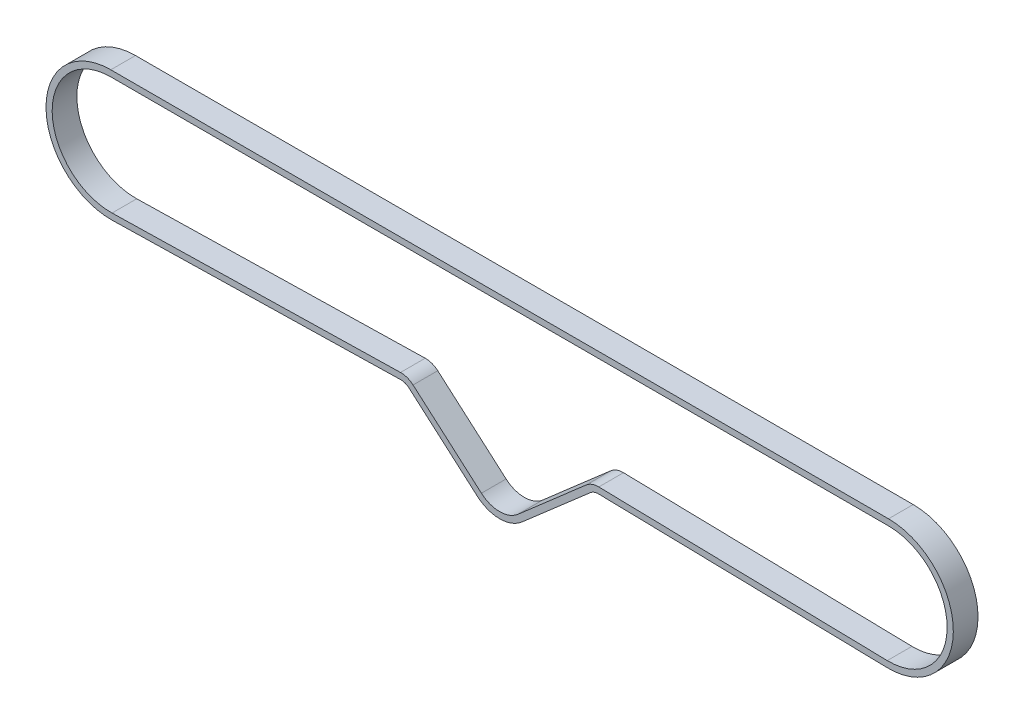
ISO-10303-21;
HEADER;
FILE_DESCRIPTION(('STEP AP214'),'2;1');
FILE_NAME('part.step','',(''),(''),'','','');
FILE_SCHEMA(('AUTOMOTIVE_DESIGN { 1 0 10303 214 1 1 1 1 }'));
ENDSEC;
DATA;
#1=APPLICATION_CONTEXT('core data for automotive mechanical design processes');
#2=APPLICATION_PROTOCOL_DEFINITION('international standard','automotive_design',2000,#1);
#3=PRODUCT_CONTEXT('',#1,'mechanical');
#4=PRODUCT('Part','Part','',(#3));
#5=PRODUCT_RELATED_PRODUCT_CATEGORY('part','',(#4));
#6=PRODUCT_DEFINITION_FORMATION('','',#4);
#7=PRODUCT_DEFINITION_CONTEXT('part definition',#1,'design');
#8=PRODUCT_DEFINITION('design','',#6,#7);
#9=PRODUCT_DEFINITION_SHAPE('','',#8);
#10=(LENGTH_UNIT() NAMED_UNIT(*) SI_UNIT(.MILLI.,.METRE.));
#11=(NAMED_UNIT(*) PLANE_ANGLE_UNIT() SI_UNIT($,.RADIAN.));
#12=(NAMED_UNIT(*) SI_UNIT($,.STERADIAN.) SOLID_ANGLE_UNIT());
#13=UNCERTAINTY_MEASURE_WITH_UNIT(LENGTH_MEASURE(1.E-05),#10,'distance_accuracy_value','');
#14=(GEOMETRIC_REPRESENTATION_CONTEXT(3) GLOBAL_UNCERTAINTY_ASSIGNED_CONTEXT((#13)) GLOBAL_UNIT_ASSIGNED_CONTEXT((#10,
#11,#12)) REPRESENTATION_CONTEXT('',''));
#15=CARTESIAN_POINT('',(0.,0.,0.));
#16=DIRECTION('',(0.,0.,1.));
#17=DIRECTION('',(1.,0.,0.));
#18=AXIS2_PLACEMENT_3D('',#15,#16,#17);
#19=CARTESIAN_POINT('',(-356.256014539639,-105.747210513827,-20.));
#20=DIRECTION('',(0.,0.,1.));
#21=DIRECTION('',(1.,0.,0.));
#22=AXIS2_PLACEMENT_3D('',#19,#20,#21);
#23=CYLINDRICAL_SURFACE('',#22,27.5);
#24=CARTESIAN_POINT('',(-356.256014539639,-105.747210513827,0.));
#25=DIRECTION('',(0.,0.,1.));
#26=DIRECTION('',(1.,0.,0.));
#27=AXIS2_PLACEMENT_3D('',#24,#25,#26);
#28=CIRCLE('',#27,27.5);
#29=CARTESIAN_POINT('',(-374.328541710126,-126.474819195776,0.));
#30=VERTEX_POINT('',#29);
#31=CARTESIAN_POINT('',(-338.183487369152,-126.474819195776,0.));
#32=VERTEX_POINT('',#31);
#33=EDGE_CURVE('E303',#30,#32,#28,.T.);
#34=ORIENTED_EDGE('',*,*,#33,.F.);
#35=DIRECTION('',(0.,0.,1.));
#36=VECTOR('',#35,1.);
#37=CARTESIAN_POINT('',(-374.328541710126,-126.474819195776,-20.));
#38=LINE('',#37,#36);
#39=CARTESIAN_POINT('',(-374.328541710126,-126.474819195776,-20.));
#40=VERTEX_POINT('',#39);
#41=EDGE_CURVE('E12',#40,#30,#38,.T.);
#42=ORIENTED_EDGE('',*,*,#41,.F.);
#43=CARTESIAN_POINT('',(-356.256014539639,-105.747210513827,-20.));
#44=DIRECTION('',(0.,0.,1.));
#45=DIRECTION('',(1.,0.,0.));
#46=AXIS2_PLACEMENT_3D('',#43,#44,#45);
#47=CIRCLE('',#46,27.5);
#48=CARTESIAN_POINT('',(-338.183487369152,-126.474819195776,-20.));
#49=VERTEX_POINT('',#48);
#50=EDGE_CURVE('E319',#40,#49,#47,.T.);
#51=ORIENTED_EDGE('',*,*,#50,.T.);
#52=DIRECTION('',(0.,0.,1.));
#53=VECTOR('',#52,1.);
#54=CARTESIAN_POINT('',(-338.183487369152,-126.474819195776,-20.));
#55=LINE('',#54,#53);
#56=EDGE_CURVE('E100',#49,#32,#55,.T.);
#57=ORIENTED_EDGE('',*,*,#56,.T.);
#58=EDGE_LOOP('',(#34,#42,#51,#57));
#59=FACE_BOUND('',#58,.T.);
#60=ADVANCED_FACE('F97',(#59),#23,.T.);
#61=CARTESIAN_POINT('',(-429.684186477644,-78.2098982658456,-20.));
#62=DIRECTION('',(-0.657182806199533,-0.753731224798141,0.));
#63=DIRECTION('',(0.753731224798142,-0.657182806199533,0.));
#64=AXIS2_PLACEMENT_3D('',#61,#62,#63);
#65=PLANE('',#64);
#66=DIRECTION('',(0.753731224798141,-0.657182806199533,0.));
#67=VECTOR('',#66,1.);
#68=CARTESIAN_POINT('',(-429.684186477644,-78.2098982658456,0.));
#69=LINE('',#68,#67);
#70=CARTESIAN_POINT('',(-429.684186477644,-78.2098982658456,0.));
#71=VERTEX_POINT('',#70);
#72=EDGE_CURVE('E323',#71,#30,#69,.T.);
#73=ORIENTED_EDGE('',*,*,#72,.F.);
#74=DIRECTION('',(0.,0.,1.));
#75=VECTOR('',#74,1.);
#76=CARTESIAN_POINT('',(-429.684186477644,-78.2098982658456,-20.));
#77=LINE('',#76,#75);
#78=CARTESIAN_POINT('',(-429.684186477644,-78.2098982658456,-20.));
#79=VERTEX_POINT('',#78);
#80=EDGE_CURVE('E105',#79,#71,#77,.T.);
#81=ORIENTED_EDGE('',*,*,#80,.F.);
#82=DIRECTION('',(0.753731224798141,-0.657182806199533,0.));
#83=VECTOR('',#82,1.);
#84=CARTESIAN_POINT('',(-429.684186477644,-78.2098982658456,-20.));
#85=LINE('',#84,#83);
#86=EDGE_CURVE('E347',#79,#40,#85,.T.);
#87=ORIENTED_EDGE('',*,*,#86,.T.);
#88=ORIENTED_EDGE('',*,*,#41,.T.);
#89=EDGE_LOOP('',(#73,#81,#87,#88));
#90=FACE_BOUND('',#89,.T.);
#91=ADVANCED_FACE('F404',(#90),#65,.T.);
#92=CARTESIAN_POINT('',(-436.256014539639,-85.747210513827,-20.));
#93=DIRECTION('',(0.,0.,1.));
#94=DIRECTION('',(1.,0.,0.));
#95=AXIS2_PLACEMENT_3D('',#92,#93,#94);
#96=CYLINDRICAL_SURFACE('',#95,10.);
#97=CARTESIAN_POINT('',(-436.256014539639,-85.747210513827,0.));
#98=DIRECTION('',(0.,0.,-1.));
#99=DIRECTION('',(-1.,0.,0.));
#100=AXIS2_PLACEMENT_3D('',#97,#98,#99);
#101=CIRCLE('',#100,10.);
#102=CARTESIAN_POINT('',(-436.46936509588,-75.7494866958696,0.));
#103=VERTEX_POINT('',#102);
#104=EDGE_CURVE('E373',#103,#71,#101,.T.);
#105=ORIENTED_EDGE('',*,*,#104,.F.);
#106=DIRECTION('',(0.,0.,1.));
#107=VECTOR('',#106,1.);
#108=CARTESIAN_POINT('',(-436.46936509588,-75.7494866958696,-20.));
#109=LINE('',#108,#107);
#110=CARTESIAN_POINT('',(-436.46936509588,-75.7494866958696,-20.));
#111=VERTEX_POINT('',#110);
#112=EDGE_CURVE('E379',#111,#103,#109,.T.);
#113=ORIENTED_EDGE('',*,*,#112,.F.);
#114=CARTESIAN_POINT('',(-436.256014539639,-85.747210513827,-20.));
#115=DIRECTION('',(0.,0.,-1.));
#116=DIRECTION('',(-1.,0.,0.));
#117=AXIS2_PLACEMENT_3D('',#114,#115,#116);
#118=CIRCLE('',#117,10.);
#119=EDGE_CURVE('E344',#111,#79,#118,.T.);
#120=ORIENTED_EDGE('',*,*,#119,.T.);
#121=ORIENTED_EDGE('',*,*,#80,.T.);
#122=EDGE_LOOP('',(#105,#113,#120,#121));
#123=FACE_BOUND('',#122,.T.);
#124=ADVANCED_FACE('F431',(#123),#96,.F.);
#125=CARTESIAN_POINT('',(-670.135919286193,-80.7359106278753,-20.));
#126=DIRECTION('',(0.0213350556241104,-0.999772381795735,0.));
#127=DIRECTION('',(0.999772381795735,0.0213350556241104,0.));
#128=AXIS2_PLACEMENT_3D('',#125,#126,#127);
#129=PLANE('',#128);
#130=DIRECTION('',(0.999772381795734,0.0213350556241104,0.));
#131=VECTOR('',#130,1.);
#132=CARTESIAN_POINT('',(-670.135919286193,-80.7359106278753,0.));
#133=LINE('',#132,#131);
#134=CARTESIAN_POINT('',(-670.135919286193,-80.7359106278753,0.));
#135=VERTEX_POINT('',#134);
#136=EDGE_CURVE('E370',#135,#103,#133,.T.);
#137=ORIENTED_EDGE('',*,*,#136,.F.);
#138=DIRECTION('',(0.,0.,1.));
#139=VECTOR('',#138,1.);
#140=CARTESIAN_POINT('',(-670.135919286193,-80.7359106278753,-20.));
#141=LINE('',#140,#139);
#142=CARTESIAN_POINT('',(-670.135919286193,-80.7359106278753,-20.));
#143=VERTEX_POINT('',#142);
#144=EDGE_CURVE('E381',#143,#135,#141,.T.);
#145=ORIENTED_EDGE('',*,*,#144,.F.);
#146=DIRECTION('',(0.999772381795734,0.0213350556241104,0.));
#147=VECTOR('',#146,1.);
#148=CARTESIAN_POINT('',(-670.135919286193,-80.7359106278753,-20.));
#149=LINE('',#148,#147);
#150=EDGE_CURVE('E341',#143,#111,#149,.T.);
#151=ORIENTED_EDGE('',*,*,#150,.T.);
#152=ORIENTED_EDGE('',*,*,#112,.T.);
#153=EDGE_LOOP('',(#137,#145,#151,#152));
#154=FACE_BOUND('',#153,.T.);
#155=ADVANCED_FACE('F429',(#154),#129,.T.);
#156=CARTESIAN_POINT('',(-671.256009706459,-28.2478605835992,-20.));
#157=DIRECTION('',(0.,0.,1.));
#158=DIRECTION('',(1.,0.,0.));
#159=AXIS2_PLACEMENT_3D('',#156,#157,#158);
#160=CYLINDRICAL_SURFACE('',#159,52.5);
#161=CARTESIAN_POINT('',(-671.256009706459,-28.2478605835992,0.));
#162=DIRECTION('',(0.,0.,1.));
#163=DIRECTION('',(1.,0.,0.));
#164=AXIS2_PLACEMENT_3D('',#161,#162,#163);
#165=CIRCLE('',#164,52.5);
#166=CARTESIAN_POINT('',(-671.256009706459,24.2521394164008,0.));
#167=VERTEX_POINT('',#166);
#168=EDGE_CURVE('E367',#167,#135,#165,.T.);
#169=ORIENTED_EDGE('',*,*,#168,.F.);
#170=DIRECTION('',(0.,0.,1.));
#171=VECTOR('',#170,1.);
#172=CARTESIAN_POINT('',(-671.256009706459,24.2521394164008,-20.));
#173=LINE('',#172,#171);
#174=CARTESIAN_POINT('',(-671.256009706459,24.2521394164008,-20.));
#175=VERTEX_POINT('',#174);
#176=EDGE_CURVE('E383',#175,#167,#173,.T.);
#177=ORIENTED_EDGE('',*,*,#176,.F.);
#178=CARTESIAN_POINT('',(-671.256009706459,-28.2478605835992,-20.));
#179=DIRECTION('',(0.,0.,1.));
#180=DIRECTION('',(1.,0.,0.));
#181=AXIS2_PLACEMENT_3D('',#178,#179,#180);
#182=CIRCLE('',#181,52.5);
#183=EDGE_CURVE('E338',#175,#143,#182,.T.);
#184=ORIENTED_EDGE('',*,*,#183,.T.);
#185=ORIENTED_EDGE('',*,*,#144,.T.);
#186=EDGE_LOOP('',(#169,#177,#184,#185));
#187=FACE_BOUND('',#186,.T.);
#188=ADVANCED_FACE('F425',(#187),#160,.T.);
#189=CARTESIAN_POINT('',(-41.2560101373099,24.252139416405,-20.));
#190=DIRECTION('',(0.,1.,0.));
#191=DIRECTION('',(-1.,0.,0.));
#192=AXIS2_PLACEMENT_3D('',#189,#190,#191);
#193=PLANE('',#192);
#194=DIRECTION('',(-1.,0.,0.));
#195=VECTOR('',#194,1.);
#196=CARTESIAN_POINT('',(-41.2560101373099,24.252139416405,0.));
#197=LINE('',#196,#195);
#198=CARTESIAN_POINT('',(-41.2560101373099,24.2521394164029,0.));
#199=VERTEX_POINT('',#198);
#200=EDGE_CURVE('E364',#199,#167,#197,.T.);
#201=ORIENTED_EDGE('',*,*,#200,.F.);
#202=DIRECTION('',(0.,0.,1.));
#203=VECTOR('',#202,1.);
#204=CARTESIAN_POINT('',(-41.2560101373099,24.2521394164029,-20.));
#205=LINE('',#204,#203);
#206=CARTESIAN_POINT('',(-41.2560101373099,24.2521394164029,-20.));
#207=VERTEX_POINT('',#206);
#208=EDGE_CURVE('E385',#207,#199,#205,.T.);
#209=ORIENTED_EDGE('',*,*,#208,.F.);
#210=DIRECTION('',(-1.,0.,0.));
#211=VECTOR('',#210,1.);
#212=CARTESIAN_POINT('',(-41.2560101373099,24.252139416405,-20.));
#213=LINE('',#212,#211);
#214=EDGE_CURVE('E335',#207,#175,#213,.T.);
#215=ORIENTED_EDGE('',*,*,#214,.T.);
#216=ORIENTED_EDGE('',*,*,#176,.T.);
#217=EDGE_LOOP('',(#201,#209,#215,#216));
#218=FACE_BOUND('',#217,.T.);
#219=ADVANCED_FACE('F421',(#218),#193,.T.);
#220=CARTESIAN_POINT('',(-41.2560101371114,-28.2478605835992,-20.));
#221=DIRECTION('',(0.,0.,1.));
#222=DIRECTION('',(1.,0.,0.));
#223=AXIS2_PLACEMENT_3D('',#220,#221,#222);
#224=CYLINDRICAL_SURFACE('',#223,52.5000000000021);
#225=CARTESIAN_POINT('',(-41.2560101371114,-28.2478605835992,0.));
#226=DIRECTION('',(0.,0.,1.));
#227=DIRECTION('',(1.,0.,0.));
#228=AXIS2_PLACEMENT_3D('',#225,#226,#227);
#229=CIRCLE('',#228,52.5000000000021);
#230=CARTESIAN_POINT('',(-42.3761005133237,-80.7359106288154,0.));
#231=VERTEX_POINT('',#230);
#232=EDGE_CURVE('E361',#231,#199,#229,.T.);
#233=ORIENTED_EDGE('',*,*,#232,.F.);
#234=DIRECTION('',(0.,0.,1.));
#235=VECTOR('',#234,1.);
#236=CARTESIAN_POINT('',(-42.3761005133237,-80.7359106288154,-20.));
#237=LINE('',#236,#235);
#238=CARTESIAN_POINT('',(-42.3761005133237,-80.7359106288154,-20.));
#239=VERTEX_POINT('',#238);
#240=EDGE_CURVE('E387',#239,#231,#237,.T.);
#241=ORIENTED_EDGE('',*,*,#240,.F.);
#242=CARTESIAN_POINT('',(-41.2560101371114,-28.2478605835992,-20.));
#243=DIRECTION('',(0.,0.,1.));
#244=DIRECTION('',(1.,0.,0.));
#245=AXIS2_PLACEMENT_3D('',#242,#243,#244);
#246=CIRCLE('',#245,52.5000000000021);
#247=EDGE_CURVE('E332',#239,#207,#246,.T.);
#248=ORIENTED_EDGE('',*,*,#247,.T.);
#249=ORIENTED_EDGE('',*,*,#208,.T.);
#250=EDGE_LOOP('',(#233,#241,#248,#249));
#251=FACE_BOUND('',#250,.T.);
#252=ADVANCED_FACE('F417',(#251),#224,.T.);
#253=CARTESIAN_POINT('',(-276.042663991827,-75.7494866956898,-20.));
#254=DIRECTION('',(-0.0213350547812224,-0.999772381813722,0.));
#255=DIRECTION('',(0.999772381813722,-0.0213350547812224,0.));
#256=AXIS2_PLACEMENT_3D('',#253,#254,#255);
#257=PLANE('',#256);
#258=DIRECTION('',(0.999772381813722,-0.0213350547812224,0.));
#259=VECTOR('',#258,1.);
#260=CARTESIAN_POINT('',(-276.042663991827,-75.7494866956898,0.));
#261=LINE('',#260,#259);
#262=CARTESIAN_POINT('',(-276.042663991827,-75.7494866956898,0.));
#263=VERTEX_POINT('',#262);
#264=EDGE_CURVE('E358',#263,#231,#261,.T.);
#265=ORIENTED_EDGE('',*,*,#264,.F.);
#266=DIRECTION('',(0.,0.,1.));
#267=VECTOR('',#266,1.);
#268=CARTESIAN_POINT('',(-276.042663991827,-75.7494866956898,-20.));
#269=LINE('',#268,#267);
#270=CARTESIAN_POINT('',(-276.042663991827,-75.7494866956898,-20.));
#271=VERTEX_POINT('',#270);
#272=EDGE_CURVE('E389',#271,#263,#269,.T.);
#273=ORIENTED_EDGE('',*,*,#272,.F.);
#274=DIRECTION('',(0.999772381813722,-0.0213350547812224,0.));
#275=VECTOR('',#274,1.);
#276=CARTESIAN_POINT('',(-276.042663991827,-75.7494866956898,-20.));
#277=LINE('',#276,#275);
#278=EDGE_CURVE('E329',#271,#239,#277,.T.);
#279=ORIENTED_EDGE('',*,*,#278,.T.);
#280=ORIENTED_EDGE('',*,*,#240,.T.);
#281=EDGE_LOOP('',(#265,#273,#279,#280));
#282=FACE_BOUND('',#281,.T.);
#283=ADVANCED_FACE('F415',(#282),#257,.T.);
#284=CARTESIAN_POINT('',(-276.256014539639,-85.7472105138271,-20.));
#285=DIRECTION('',(0.,0.,1.));
#286=DIRECTION('',(1.,0.,0.));
#287=AXIS2_PLACEMENT_3D('',#284,#285,#286);
#288=CYLINDRICAL_SURFACE('',#287,10.);
#289=CARTESIAN_POINT('',(-276.256014539639,-85.7472105138271,0.));
#290=DIRECTION('',(0.,0.,-1.));
#291=DIRECTION('',(-1.,0.,0.));
#292=AXIS2_PLACEMENT_3D('',#289,#290,#291);
#293=CIRCLE('',#292,10.);
#294=CARTESIAN_POINT('',(-282.827842601634,-78.2098982658457,0.));
#295=VERTEX_POINT('',#294);
#296=EDGE_CURVE('E355',#295,#263,#293,.T.);
#297=ORIENTED_EDGE('',*,*,#296,.F.);
#298=DIRECTION('',(0.,0.,1.));
#299=VECTOR('',#298,1.);
#300=CARTESIAN_POINT('',(-282.827842601634,-78.2098982658457,-20.));
#301=LINE('',#300,#299);
#302=CARTESIAN_POINT('',(-282.827842601634,-78.2098982658457,-20.));
#303=VERTEX_POINT('',#302);
#304=EDGE_CURVE('E390',#303,#295,#301,.T.);
#305=ORIENTED_EDGE('',*,*,#304,.F.);
#306=CARTESIAN_POINT('',(-276.256014539639,-85.7472105138271,-20.));
#307=DIRECTION('',(0.,0.,-1.));
#308=DIRECTION('',(-1.,0.,0.));
#309=AXIS2_PLACEMENT_3D('',#306,#307,#308);
#310=CIRCLE('',#309,10.);
#311=EDGE_CURVE('E326',#303,#271,#310,.T.);
#312=ORIENTED_EDGE('',*,*,#311,.T.);
#313=ORIENTED_EDGE('',*,*,#272,.T.);
#314=EDGE_LOOP('',(#297,#305,#312,#313));
#315=FACE_BOUND('',#314,.T.);
#316=ADVANCED_FACE('F411',(#315),#288,.F.);
#317=CARTESIAN_POINT('',(-338.183487369152,-126.474819195776,-20.));
#318=DIRECTION('',(0.657182806199535,-0.75373122479814,0.));
#319=DIRECTION('',(0.75373122479814,0.657182806199535,0.));
#320=AXIS2_PLACEMENT_3D('',#317,#318,#319);
#321=PLANE('',#320);
#322=DIRECTION('',(0.75373122479814,0.657182806199535,0.));
#323=VECTOR('',#322,1.);
#324=CARTESIAN_POINT('',(-338.183487369152,-126.474819195776,0.));
#325=LINE('',#324,#323);
#326=EDGE_CURVE('E352',#32,#295,#325,.T.);
#327=ORIENTED_EDGE('',*,*,#326,.F.);
#328=ORIENTED_EDGE('',*,*,#56,.F.);
#329=DIRECTION('',(0.75373122479814,0.657182806199535,0.));
#330=VECTOR('',#329,1.);
#331=CARTESIAN_POINT('',(-338.183487369152,-126.474819195776,-20.));
#332=LINE('',#331,#330);
#333=EDGE_CURVE('E322',#49,#303,#332,.T.);
#334=ORIENTED_EDGE('',*,*,#333,.T.);
#335=ORIENTED_EDGE('',*,*,#304,.T.);
#336=EDGE_LOOP('',(#327,#328,#334,#335));
#337=FACE_BOUND('',#336,.T.);
#338=ADVANCED_FACE('F398',(#337),#321,.T.);
#339=CARTESIAN_POINT('',(-356.256014539639,-105.747210513827,-20.));
#340=DIRECTION('',(0.,0.,1.));
#341=DIRECTION('',(1.,0.,0.));
#342=AXIS2_PLACEMENT_3D('',#339,#340,#341);
#343=PLANE('',#342);
#344=DIRECTION('',(0.753731224798142,-0.657182806199533,0.));
#345=VECTOR('',#344,1.);
#346=CARTESIAN_POINT('',(-426.398272446646,-74.4412421418549,-20.));
#347=LINE('',#346,#345);
#348=CARTESIAN_POINT('',(-426.398272446646,-74.4412421418549,-20.));
#349=VERTEX_POINT('',#348);
#350=CARTESIAN_POINT('',(-371.042627679128,-122.706163071785,-20.));
#351=VERTEX_POINT('',#350);
#352=EDGE_CURVE('E242',#349,#351,#347,.T.);
#353=ORIENTED_EDGE('',*,*,#352,.T.);
#354=CARTESIAN_POINT('',(-356.256014539639,-105.747210513827,-20.));
#355=DIRECTION('',(0.,0.,1.));
#356=DIRECTION('',(1.,0.,0.));
#357=AXIS2_PLACEMENT_3D('',#354,#355,#356);
#358=CIRCLE('',#357,22.5);
#359=CARTESIAN_POINT('',(-341.469401400149,-122.706163071785,-20.));
#360=VERTEX_POINT('',#359);
#361=EDGE_CURVE('E236',#351,#360,#358,.T.);
#362=ORIENTED_EDGE('',*,*,#361,.T.);
#363=DIRECTION('',(0.75373122479814,0.657182806199535,0.));
#364=VECTOR('',#363,1.);
#365=CARTESIAN_POINT('',(-341.469401400149,-122.706163071785,-20.));
#366=LINE('',#365,#364);
#367=CARTESIAN_POINT('',(-286.113756632632,-74.441242141855,-20.));
#368=VERTEX_POINT('',#367);
#369=EDGE_CURVE('E245',#360,#368,#366,.T.);
#370=ORIENTED_EDGE('',*,*,#369,.T.);
#371=CARTESIAN_POINT('',(-276.256014539639,-85.7472105138271,-20.));
#372=DIRECTION('',(0.,0.,1.));
#373=DIRECTION('',(1.,0.,0.));
#374=AXIS2_PLACEMENT_3D('',#371,#372,#373);
#375=CIRCLE('',#374,15.);
#376=CARTESIAN_POINT('',(-275.935988717921,-70.7506247866212,-20.));
#377=VERTEX_POINT('',#376);
#378=EDGE_CURVE('E113',#368,#377,#375,.F.);
#379=ORIENTED_EDGE('',*,*,#378,.T.);
#380=DIRECTION('',(0.999772381813722,-0.0213350547812224,0.));
#381=VECTOR('',#380,1.);
#382=CARTESIAN_POINT('',(-275.935988717921,-70.7506247866212,-20.));
#383=LINE('',#382,#381);
#384=CARTESIAN_POINT('',(-42.2694252394175,-75.7370487197468,-20.));
#385=VERTEX_POINT('',#384);
#386=EDGE_CURVE('E260',#377,#385,#383,.T.);
#387=ORIENTED_EDGE('',*,*,#386,.T.);
#388=CARTESIAN_POINT('',(-41.2560101371114,-28.2478605835992,-20.));
#389=DIRECTION('',(0.,0.,1.));
#390=DIRECTION('',(1.,0.,0.));
#391=AXIS2_PLACEMENT_3D('',#388,#389,#390);
#392=CIRCLE('',#391,47.5000000000021);
#393=CARTESIAN_POINT('',(-41.256010137291,19.2521394164029,-20.));
#394=VERTEX_POINT('',#393);
#395=EDGE_CURVE('E263',#385,#394,#392,.T.);
#396=ORIENTED_EDGE('',*,*,#395,.T.);
#397=DIRECTION('',(-1.,0.,0.));
#398=VECTOR('',#397,1.);
#399=CARTESIAN_POINT('',(-41.2560101373098,19.252139416405,-20.));
#400=LINE('',#399,#398);
#401=CARTESIAN_POINT('',(-671.256009706459,19.2521394164008,-20.));
#402=VERTEX_POINT('',#401);
#403=EDGE_CURVE('E266',#394,#402,#400,.T.);
#404=ORIENTED_EDGE('',*,*,#403,.T.);
#405=CARTESIAN_POINT('',(-671.256009706459,-28.2478605835992,-20.));
#406=DIRECTION('',(0.,0.,1.));
#407=DIRECTION('',(1.,0.,0.));
#408=AXIS2_PLACEMENT_3D('',#405,#406,#407);
#409=CIRCLE('',#408,47.5);
#410=CARTESIAN_POINT('',(-670.242594564314,-75.7370487188966,-20.));
#411=VERTEX_POINT('',#410);
#412=EDGE_CURVE('E269',#402,#411,#409,.T.);
#413=ORIENTED_EDGE('',*,*,#412,.T.);
#414=DIRECTION('',(0.999772381795735,0.0213350556241104,0.));
#415=VECTOR('',#414,1.);
#416=CARTESIAN_POINT('',(-670.242594564314,-75.7370487188966,-20.));
#417=LINE('',#416,#415);
#418=CARTESIAN_POINT('',(-436.576040374001,-70.750624786891,-20.));
#419=VERTEX_POINT('',#418);
#420=EDGE_CURVE('E272',#411,#419,#417,.T.);
#421=ORIENTED_EDGE('',*,*,#420,.T.);
#422=CARTESIAN_POINT('',(-436.256014539639,-85.747210513827,-20.));
#423=DIRECTION('',(0.,0.,1.));
#424=DIRECTION('',(1.,0.,0.));
#425=AXIS2_PLACEMENT_3D('',#422,#423,#424);
#426=CIRCLE('',#425,15.);
#427=EDGE_CURVE('E275',#419,#349,#426,.F.);
#428=ORIENTED_EDGE('',*,*,#427,.T.);
#429=EDGE_LOOP('',(#353,#362,#370,#379,#387,#396,#404,#413,#421,#428));
#430=FACE_BOUND('',#429,.T.);
#431=ORIENTED_EDGE('',*,*,#50,.F.);
#432=ORIENTED_EDGE('',*,*,#86,.F.);
#433=ORIENTED_EDGE('',*,*,#119,.F.);
#434=ORIENTED_EDGE('',*,*,#150,.F.);
#435=ORIENTED_EDGE('',*,*,#183,.F.);
#436=ORIENTED_EDGE('',*,*,#214,.F.);
#437=ORIENTED_EDGE('',*,*,#247,.F.);
#438=ORIENTED_EDGE('',*,*,#278,.F.);
#439=ORIENTED_EDGE('',*,*,#311,.F.);
#440=ORIENTED_EDGE('',*,*,#333,.F.);
#441=EDGE_LOOP('',(#431,#432,#433,#434,#435,#436,#437,#438,#439,#440));
#442=FACE_BOUND('',#441,.T.);
#443=ADVANCED_FACE('F249',(#430,#442),#343,.F.);
#444=CARTESIAN_POINT('',(-356.256014539639,-105.747210513827,0.));
#445=DIRECTION('',(0.,0.,1.));
#446=DIRECTION('',(1.,0.,0.));
#447=AXIS2_PLACEMENT_3D('',#444,#445,#446);
#448=PLANE('',#447);
#449=CARTESIAN_POINT('',(-356.256014539639,-105.747210513827,0.));
#450=DIRECTION('',(0.,0.,1.));
#451=DIRECTION('',(1.,0.,0.));
#452=AXIS2_PLACEMENT_3D('',#449,#450,#451);
#453=CIRCLE('',#452,22.5);
#454=CARTESIAN_POINT('',(-371.042627679128,-122.706163071785,0.));
#455=VERTEX_POINT('',#454);
#456=CARTESIAN_POINT('',(-341.469401400149,-122.706163071785,0.));
#457=VERTEX_POINT('',#456);
#458=EDGE_CURVE('E121',#455,#457,#453,.T.);
#459=ORIENTED_EDGE('',*,*,#458,.F.);
#460=DIRECTION('',(0.753731224798142,-0.657182806199533,0.));
#461=VECTOR('',#460,1.);
#462=CARTESIAN_POINT('',(-426.398272446646,-74.4412421418549,0.));
#463=LINE('',#462,#461);
#464=CARTESIAN_POINT('',(-426.398272446646,-74.4412421418549,0.));
#465=VERTEX_POINT('',#464);
#466=EDGE_CURVE('E253',#465,#455,#463,.T.);
#467=ORIENTED_EDGE('',*,*,#466,.F.);
#468=CARTESIAN_POINT('',(-436.256014539639,-85.747210513827,0.));
#469=DIRECTION('',(0.,0.,1.));
#470=DIRECTION('',(1.,0.,0.));
#471=AXIS2_PLACEMENT_3D('',#468,#469,#470);
#472=CIRCLE('',#471,15.);
#473=CARTESIAN_POINT('',(-436.576040374001,-70.750624786891,0.));
#474=VERTEX_POINT('',#473);
#475=EDGE_CURVE('E256',#474,#465,#472,.F.);
#476=ORIENTED_EDGE('',*,*,#475,.F.);
#477=DIRECTION('',(0.999772381795735,0.0213350556241104,0.));
#478=VECTOR('',#477,1.);
#479=CARTESIAN_POINT('',(-670.242594564314,-75.7370487188966,0.));
#480=LINE('',#479,#478);
#481=CARTESIAN_POINT('',(-670.242594564314,-75.7370487188966,0.));
#482=VERTEX_POINT('',#481);
#483=EDGE_CURVE('E296',#482,#474,#480,.T.);
#484=ORIENTED_EDGE('',*,*,#483,.F.);
#485=CARTESIAN_POINT('',(-671.256009706459,-28.2478605835992,0.));
#486=DIRECTION('',(0.,0.,1.));
#487=DIRECTION('',(1.,0.,0.));
#488=AXIS2_PLACEMENT_3D('',#485,#486,#487);
#489=CIRCLE('',#488,47.5);
#490=CARTESIAN_POINT('',(-671.256009706459,19.2521394164008,0.));
#491=VERTEX_POINT('',#490);
#492=EDGE_CURVE('E293',#491,#482,#489,.T.);
#493=ORIENTED_EDGE('',*,*,#492,.F.);
#494=DIRECTION('',(-1.,0.,0.));
#495=VECTOR('',#494,1.);
#496=CARTESIAN_POINT('',(-41.2560101373098,19.252139416405,0.));
#497=LINE('',#496,#495);
#498=CARTESIAN_POINT('',(-41.256010137291,19.2521394164029,0.));
#499=VERTEX_POINT('',#498);
#500=EDGE_CURVE('E290',#499,#491,#497,.T.);
#501=ORIENTED_EDGE('',*,*,#500,.F.);
#502=CARTESIAN_POINT('',(-41.2560101371114,-28.2478605835992,0.));
#503=DIRECTION('',(0.,0.,1.));
#504=DIRECTION('',(1.,0.,0.));
#505=AXIS2_PLACEMENT_3D('',#502,#503,#504);
#506=CIRCLE('',#505,47.5000000000021);
#507=CARTESIAN_POINT('',(-42.2694252394175,-75.7370487197468,0.));
#508=VERTEX_POINT('',#507);
#509=EDGE_CURVE('E287',#508,#499,#506,.T.);
#510=ORIENTED_EDGE('',*,*,#509,.F.);
#511=DIRECTION('',(0.999772381813722,-0.0213350547812224,0.));
#512=VECTOR('',#511,1.);
#513=CARTESIAN_POINT('',(-275.935988717921,-70.7506247866212,0.));
#514=LINE('',#513,#512);
#515=CARTESIAN_POINT('',(-275.935988717921,-70.7506247866212,0.));
#516=VERTEX_POINT('',#515);
#517=EDGE_CURVE('E284',#516,#508,#514,.T.);
#518=ORIENTED_EDGE('',*,*,#517,.F.);
#519=CARTESIAN_POINT('',(-276.256014539639,-85.7472105138271,0.));
#520=DIRECTION('',(0.,0.,1.));
#521=DIRECTION('',(1.,0.,0.));
#522=AXIS2_PLACEMENT_3D('',#519,#520,#521);
#523=CIRCLE('',#522,15.);
#524=CARTESIAN_POINT('',(-286.113756632632,-74.4412421418549,0.));
#525=VERTEX_POINT('',#524);
#526=EDGE_CURVE('E281',#525,#516,#523,.F.);
#527=ORIENTED_EDGE('',*,*,#526,.F.);
#528=DIRECTION('',(0.75373122479814,0.657182806199535,0.));
#529=VECTOR('',#528,1.);
#530=CARTESIAN_POINT('',(-341.469401400149,-122.706163071785,0.));
#531=LINE('',#530,#529);
#532=EDGE_CURVE('E279',#457,#525,#531,.T.);
#533=ORIENTED_EDGE('',*,*,#532,.F.);
#534=EDGE_LOOP('',(#459,#467,#476,#484,#493,#501,#510,#518,#527,#533));
#535=FACE_BOUND('',#534,.T.);
#536=ORIENTED_EDGE('',*,*,#33,.T.);
#537=ORIENTED_EDGE('',*,*,#326,.T.);
#538=ORIENTED_EDGE('',*,*,#296,.T.);
#539=ORIENTED_EDGE('',*,*,#264,.T.);
#540=ORIENTED_EDGE('',*,*,#232,.T.);
#541=ORIENTED_EDGE('',*,*,#200,.T.);
#542=ORIENTED_EDGE('',*,*,#168,.T.);
#543=ORIENTED_EDGE('',*,*,#136,.T.);
#544=ORIENTED_EDGE('',*,*,#104,.T.);
#545=ORIENTED_EDGE('',*,*,#72,.T.);
#546=EDGE_LOOP('',(#536,#537,#538,#539,#540,#541,#542,#543,#544,#545));
#547=FACE_BOUND('',#546,.T.);
#548=ADVANCED_FACE('F400',(#535,#547),#448,.T.);
#549=CARTESIAN_POINT('',(-356.256014539639,-105.747210513827,-20.));
#550=DIRECTION('',(0.,0.,1.));
#551=DIRECTION('',(1.,0.,0.));
#552=AXIS2_PLACEMENT_3D('',#549,#550,#551);
#553=CYLINDRICAL_SURFACE('',#552,22.5);
#554=ORIENTED_EDGE('',*,*,#458,.T.);
#555=DIRECTION('',(0.,0.,1.));
#556=VECTOR('',#555,1.);
#557=CARTESIAN_POINT('',(-341.469401400149,-122.706163071785,-20.));
#558=LINE('',#557,#556);
#559=EDGE_CURVE('E232',#360,#457,#558,.T.);
#560=ORIENTED_EDGE('',*,*,#559,.F.);
#561=ORIENTED_EDGE('',*,*,#361,.F.);
#562=DIRECTION('',(0.,0.,1.));
#563=VECTOR('',#562,1.);
#564=CARTESIAN_POINT('',(-371.042627679128,-122.706163071785,-20.));
#565=LINE('',#564,#563);
#566=EDGE_CURVE('E301',#351,#455,#565,.T.);
#567=ORIENTED_EDGE('',*,*,#566,.T.);
#568=EDGE_LOOP('',(#554,#560,#561,#567));
#569=FACE_BOUND('',#568,.T.);
#570=ADVANCED_FACE('F234',(#569),#553,.F.);
#571=CARTESIAN_POINT('',(-426.398272446646,-74.4412421418549,-20.));
#572=DIRECTION('',(-0.657182806199533,-0.753731224798142,0.));
#573=DIRECTION('',(0.753731224798142,-0.657182806199533,0.));
#574=AXIS2_PLACEMENT_3D('',#571,#572,#573);
#575=PLANE('',#574);
#576=ORIENTED_EDGE('',*,*,#466,.T.);
#577=ORIENTED_EDGE('',*,*,#566,.F.);
#578=ORIENTED_EDGE('',*,*,#352,.F.);
#579=DIRECTION('',(0.,0.,1.));
#580=VECTOR('',#579,1.);
#581=CARTESIAN_POINT('',(-426.398272446646,-74.4412421418549,-20.));
#582=LINE('',#581,#580);
#583=EDGE_CURVE('E304',#349,#465,#582,.T.);
#584=ORIENTED_EDGE('',*,*,#583,.T.);
#585=EDGE_LOOP('',(#576,#577,#578,#584));
#586=FACE_BOUND('',#585,.T.);
#587=ADVANCED_FACE('F530',(#586),#575,.F.);
#588=CARTESIAN_POINT('',(-436.256014539639,-85.747210513827,-20.));
#589=DIRECTION('',(0.,0.,1.));
#590=DIRECTION('',(1.,0.,0.));
#591=AXIS2_PLACEMENT_3D('',#588,#589,#590);
#592=CYLINDRICAL_SURFACE('',#591,15.);
#593=ORIENTED_EDGE('',*,*,#475,.T.);
#594=ORIENTED_EDGE('',*,*,#583,.F.);
#595=ORIENTED_EDGE('',*,*,#427,.F.);
#596=DIRECTION('',(0.,0.,1.));
#597=VECTOR('',#596,1.);
#598=CARTESIAN_POINT('',(-436.576040374001,-70.750624786891,-20.));
#599=LINE('',#598,#597);
#600=EDGE_CURVE('E306',#419,#474,#599,.T.);
#601=ORIENTED_EDGE('',*,*,#600,.T.);
#602=EDGE_LOOP('',(#593,#594,#595,#601));
#603=FACE_BOUND('',#602,.T.);
#604=ADVANCED_FACE('F539',(#603),#592,.T.);
#605=CARTESIAN_POINT('',(-670.242594564314,-75.7370487188966,-20.));
#606=DIRECTION('',(0.0213350556241104,-0.999772381795735,0.));
#607=DIRECTION('',(0.999772381795735,0.0213350556241104,0.));
#608=AXIS2_PLACEMENT_3D('',#605,#606,#607);
#609=PLANE('',#608);
#610=ORIENTED_EDGE('',*,*,#483,.T.);
#611=ORIENTED_EDGE('',*,*,#600,.F.);
#612=ORIENTED_EDGE('',*,*,#420,.F.);
#613=DIRECTION('',(0.,0.,1.));
#614=VECTOR('',#613,1.);
#615=CARTESIAN_POINT('',(-670.242594564314,-75.7370487188966,-20.));
#616=LINE('',#615,#614);
#617=EDGE_CURVE('E308',#411,#482,#616,.T.);
#618=ORIENTED_EDGE('',*,*,#617,.T.);
#619=EDGE_LOOP('',(#610,#611,#612,#618));
#620=FACE_BOUND('',#619,.T.);
#621=ADVANCED_FACE('F549',(#620),#609,.F.);
#622=CARTESIAN_POINT('',(-671.256009706459,-28.2478605835992,-20.));
#623=DIRECTION('',(0.,0.,1.));
#624=DIRECTION('',(1.,0.,0.));
#625=AXIS2_PLACEMENT_3D('',#622,#623,#624);
#626=CYLINDRICAL_SURFACE('',#625,47.5);
#627=ORIENTED_EDGE('',*,*,#492,.T.);
#628=ORIENTED_EDGE('',*,*,#617,.F.);
#629=ORIENTED_EDGE('',*,*,#412,.F.);
#630=DIRECTION('',(0.,0.,1.));
#631=VECTOR('',#630,1.);
#632=CARTESIAN_POINT('',(-671.256009706459,19.2521394164008,-20.));
#633=LINE('',#632,#631);
#634=EDGE_CURVE('E310',#402,#491,#633,.T.);
#635=ORIENTED_EDGE('',*,*,#634,.T.);
#636=EDGE_LOOP('',(#627,#628,#629,#635));
#637=FACE_BOUND('',#636,.T.);
#638=ADVANCED_FACE('F559',(#637),#626,.F.);
#639=CARTESIAN_POINT('',(-41.2560101373098,19.252139416405,-20.));
#640=DIRECTION('',(0.,1.,0.));
#641=DIRECTION('',(-1.,0.,0.));
#642=AXIS2_PLACEMENT_3D('',#639,#640,#641);
#643=PLANE('',#642);
#644=ORIENTED_EDGE('',*,*,#500,.T.);
#645=ORIENTED_EDGE('',*,*,#634,.F.);
#646=ORIENTED_EDGE('',*,*,#403,.F.);
#647=DIRECTION('',(0.,0.,1.));
#648=VECTOR('',#647,1.);
#649=CARTESIAN_POINT('',(-41.256010137291,19.2521394164029,-20.));
#650=LINE('',#649,#648);
#651=EDGE_CURVE('E312',#394,#499,#650,.T.);
#652=ORIENTED_EDGE('',*,*,#651,.T.);
#653=EDGE_LOOP('',(#644,#645,#646,#652));
#654=FACE_BOUND('',#653,.T.);
#655=ADVANCED_FACE('F569',(#654),#643,.F.);
#656=CARTESIAN_POINT('',(-41.2560101371114,-28.2478605835992,-20.));
#657=DIRECTION('',(0.,0.,1.));
#658=DIRECTION('',(1.,0.,0.));
#659=AXIS2_PLACEMENT_3D('',#656,#657,#658);
#660=CYLINDRICAL_SURFACE('',#659,47.5000000000021);
#661=ORIENTED_EDGE('',*,*,#509,.T.);
#662=ORIENTED_EDGE('',*,*,#651,.F.);
#663=ORIENTED_EDGE('',*,*,#395,.F.);
#664=DIRECTION('',(0.,0.,1.));
#665=VECTOR('',#664,1.);
#666=CARTESIAN_POINT('',(-42.2694252394175,-75.7370487197468,-20.));
#667=LINE('',#666,#665);
#668=EDGE_CURVE('E314',#385,#508,#667,.T.);
#669=ORIENTED_EDGE('',*,*,#668,.T.);
#670=EDGE_LOOP('',(#661,#662,#663,#669));
#671=FACE_BOUND('',#670,.T.);
#672=ADVANCED_FACE('F579',(#671),#660,.F.);
#673=CARTESIAN_POINT('',(-275.935988717921,-70.7506247866212,-20.));
#674=DIRECTION('',(-0.0213350547812224,-0.999772381813722,0.));
#675=DIRECTION('',(0.999772381813722,-0.0213350547812224,0.));
#676=AXIS2_PLACEMENT_3D('',#673,#674,#675);
#677=PLANE('',#676);
#678=ORIENTED_EDGE('',*,*,#517,.T.);
#679=ORIENTED_EDGE('',*,*,#668,.F.);
#680=ORIENTED_EDGE('',*,*,#386,.F.);
#681=DIRECTION('',(0.,0.,1.));
#682=VECTOR('',#681,1.);
#683=CARTESIAN_POINT('',(-275.935988717921,-70.7506247866212,-20.));
#684=LINE('',#683,#682);
#685=EDGE_CURVE('E316',#377,#516,#684,.T.);
#686=ORIENTED_EDGE('',*,*,#685,.T.);
#687=EDGE_LOOP('',(#678,#679,#680,#686));
#688=FACE_BOUND('',#687,.T.);
#689=ADVANCED_FACE('F589',(#688),#677,.F.);
#690=CARTESIAN_POINT('',(-276.256014539639,-85.7472105138271,-20.));
#691=DIRECTION('',(0.,0.,1.));
#692=DIRECTION('',(1.,0.,0.));
#693=AXIS2_PLACEMENT_3D('',#690,#691,#692);
#694=CYLINDRICAL_SURFACE('',#693,15.);
#695=ORIENTED_EDGE('',*,*,#526,.T.);
#696=ORIENTED_EDGE('',*,*,#685,.F.);
#697=ORIENTED_EDGE('',*,*,#378,.F.);
#698=DIRECTION('',(0.,0.,1.));
#699=VECTOR('',#698,1.);
#700=CARTESIAN_POINT('',(-286.113756632632,-74.4412421418549,-20.));
#701=LINE('',#700,#699);
#702=EDGE_CURVE('E241',#368,#525,#701,.T.);
#703=ORIENTED_EDGE('',*,*,#702,.T.);
#704=EDGE_LOOP('',(#695,#696,#697,#703));
#705=FACE_BOUND('',#704,.T.);
#706=ADVANCED_FACE('F599',(#705),#694,.T.);
#707=CARTESIAN_POINT('',(-341.469401400149,-122.706163071785,-20.));
#708=DIRECTION('',(0.657182806199535,-0.75373122479814,0.));
#709=DIRECTION('',(0.75373122479814,0.657182806199535,0.));
#710=AXIS2_PLACEMENT_3D('',#707,#708,#709);
#711=PLANE('',#710);
#712=ORIENTED_EDGE('',*,*,#532,.T.);
#713=ORIENTED_EDGE('',*,*,#702,.F.);
#714=ORIENTED_EDGE('',*,*,#369,.F.);
#715=ORIENTED_EDGE('',*,*,#559,.T.);
#716=EDGE_LOOP('',(#712,#713,#714,#715));
#717=FACE_BOUND('',#716,.T.);
#718=ADVANCED_FACE('F246',(#717),#711,.F.);
#719=CLOSED_SHELL('',(#60,#91,#124,#155,#188,#219,#252,#283,#316,#338,#443,#548,#570,#587,#604,
#621,#638,#655,#672,#689,#706,#718));
#720=MANIFOLD_SOLID_BREP('B2',#719);
#721=ADVANCED_BREP_SHAPE_REPRESENTATION('',(#18,#720),#14);
#722=SHAPE_DEFINITION_REPRESENTATION(#9,#721);
ENDSEC;
END-ISO-10303-21;
